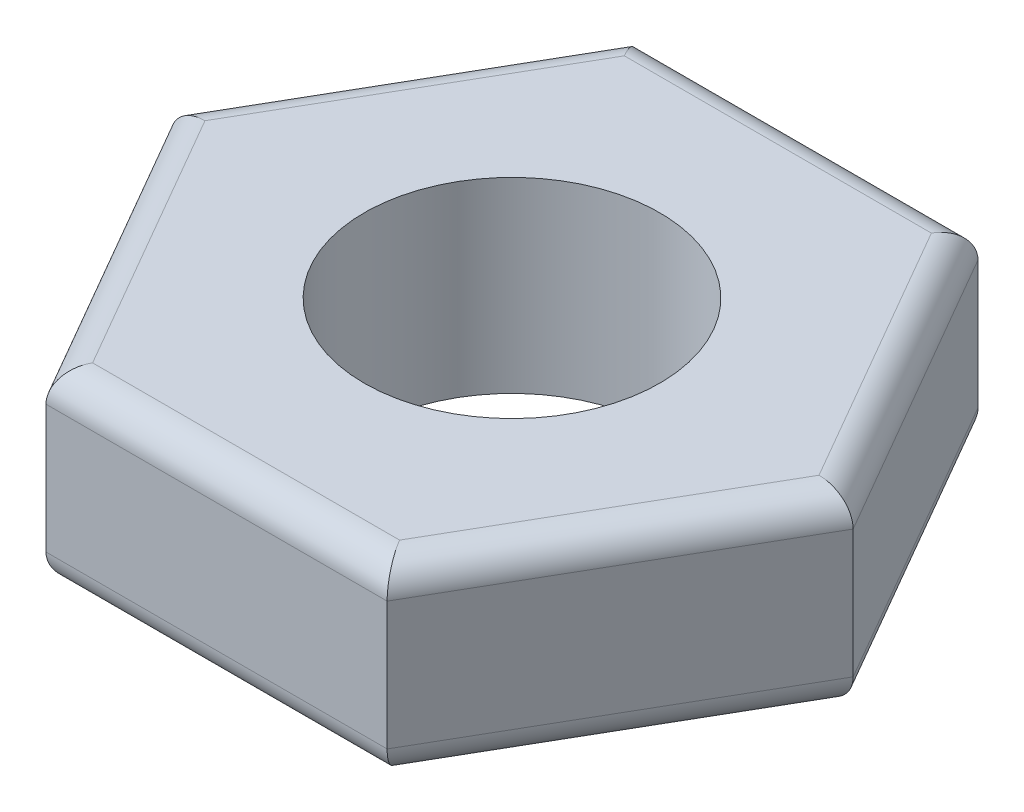
ISO-10303-21;
HEADER;
FILE_DESCRIPTION(('STEP AP214'),'2;1');
FILE_NAME('part.step','',(''),(''),'','','');
FILE_SCHEMA(('AUTOMOTIVE_DESIGN { 1 0 10303 214 1 1 1 1 }'));
ENDSEC;
DATA;
#1=APPLICATION_CONTEXT('core data for automotive mechanical design processes');
#2=APPLICATION_PROTOCOL_DEFINITION('international standard','automotive_design',2000,#1);
#3=PRODUCT_CONTEXT('',#1,'mechanical');
#4=PRODUCT('Part','Part','',(#3));
#5=PRODUCT_RELATED_PRODUCT_CATEGORY('part','',(#4));
#6=PRODUCT_DEFINITION_FORMATION('','',#4);
#7=PRODUCT_DEFINITION_CONTEXT('part definition',#1,'design');
#8=PRODUCT_DEFINITION('design','',#6,#7);
#9=PRODUCT_DEFINITION_SHAPE('','',#8);
#10=(LENGTH_UNIT() NAMED_UNIT(*) SI_UNIT(.MILLI.,.METRE.));
#11=(NAMED_UNIT(*) PLANE_ANGLE_UNIT() SI_UNIT($,.RADIAN.));
#12=(NAMED_UNIT(*) SI_UNIT($,.STERADIAN.) SOLID_ANGLE_UNIT());
#13=UNCERTAINTY_MEASURE_WITH_UNIT(LENGTH_MEASURE(1.E-05),#10,'distance_accuracy_value','');
#14=(GEOMETRIC_REPRESENTATION_CONTEXT(3) GLOBAL_UNCERTAINTY_ASSIGNED_CONTEXT((#13)) GLOBAL_UNIT_ASSIGNED_CONTEXT((#10,
#11,#12)) REPRESENTATION_CONTEXT('',''));
#15=CARTESIAN_POINT('',(0.,0.,0.));
#16=DIRECTION('',(0.,0.,1.));
#17=DIRECTION('',(1.,0.,0.));
#18=AXIS2_PLACEMENT_3D('',#15,#16,#17);
#19=CARTESIAN_POINT('',(-1.73205080756886,1.9,3.00000000000001));
#20=DIRECTION('',(0.,0.,-1.));
#21=DIRECTION('',(-1.,0.,0.));
#22=AXIS2_PLACEMENT_3D('',#19,#20,#21);
#23=PLANE('',#22);
#24=DIRECTION('',(0.,-1.,0.));
#25=VECTOR('',#24,1.);
#26=CARTESIAN_POINT('',(-1.73205080756886,1.9,3.00000000000001));
#27=LINE('',#26,#25);
#28=CARTESIAN_POINT('',(-1.73205080756886,1.6,3.00000000000001));
#29=VERTEX_POINT('',#28);
#30=CARTESIAN_POINT('',(-1.73205080756886,0.3,3.00000000000001));
#31=VERTEX_POINT('',#30);
#32=EDGE_CURVE('E227',#29,#31,#27,.T.);
#33=ORIENTED_EDGE('',*,*,#32,.T.);
#34=DIRECTION('',(1.,0.,0.));
#35=VECTOR('',#34,1.);
#36=CARTESIAN_POINT('',(-1.73205080756886,0.3,3.00000000000001));
#37=LINE('',#36,#35);
#38=CARTESIAN_POINT('',(1.73205080756889,0.3,2.99999999999999));
#39=VERTEX_POINT('',#38);
#40=EDGE_CURVE('E193',#31,#39,#37,.T.);
#41=ORIENTED_EDGE('',*,*,#40,.T.);
#42=DIRECTION('',(0.,-1.,0.));
#43=VECTOR('',#42,1.);
#44=CARTESIAN_POINT('',(1.73205080756889,1.9,2.99999999999999));
#45=LINE('',#44,#43);
#46=CARTESIAN_POINT('',(1.73205080756889,1.6,2.99999999999999));
#47=VERTEX_POINT('',#46);
#48=EDGE_CURVE('E145',#47,#39,#45,.T.);
#49=ORIENTED_EDGE('',*,*,#48,.F.);
#50=DIRECTION('',(1.,0.,0.));
#51=VECTOR('',#50,1.);
#52=CARTESIAN_POINT('',(-1.73205080756886,1.6,3.00000000000001));
#53=LINE('',#52,#51);
#54=EDGE_CURVE('E195',#47,#29,#53,.F.);
#55=ORIENTED_EDGE('',*,*,#54,.T.);
#56=EDGE_LOOP('',(#33,#41,#49,#55));
#57=FACE_BOUND('',#56,.T.);
#58=ADVANCED_FACE('F34',(#57),#23,.F.);
#59=CARTESIAN_POINT('',(1.73205080756889,1.9,2.99999999999999));
#60=DIRECTION('',(-0.866025403784441,0.,-0.499999999999995));
#61=DIRECTION('',(-0.499999999999995,0.,0.866025403784441));
#62=AXIS2_PLACEMENT_3D('',#59,#60,#61);
#63=PLANE('',#62);
#64=ORIENTED_EDGE('',*,*,#48,.T.);
#65=DIRECTION('',(0.499999999999995,0.,-0.866025403784441));
#66=VECTOR('',#65,1.);
#67=CARTESIAN_POINT('',(1.73205080756889,0.3,2.99999999999999));
#68=LINE('',#67,#66);
#69=CARTESIAN_POINT('',(3.46410161513776,0.3,0.));
#70=VERTEX_POINT('',#69);
#71=EDGE_CURVE('E144',#39,#70,#68,.T.);
#72=ORIENTED_EDGE('',*,*,#71,.T.);
#73=DIRECTION('',(0.,-1.,0.));
#74=VECTOR('',#73,1.);
#75=CARTESIAN_POINT('',(3.46410161513776,1.9,0.));
#76=LINE('',#75,#74);
#77=CARTESIAN_POINT('',(3.46410161513776,1.6,0.));
#78=VERTEX_POINT('',#77);
#79=EDGE_CURVE('E127',#78,#70,#76,.T.);
#80=ORIENTED_EDGE('',*,*,#79,.F.);
#81=DIRECTION('',(0.499999999999995,0.,-0.866025403784441));
#82=VECTOR('',#81,1.);
#83=CARTESIAN_POINT('',(1.73205080756889,1.6,2.99999999999999));
#84=LINE('',#83,#82);
#85=EDGE_CURVE('E141',#78,#47,#84,.F.);
#86=ORIENTED_EDGE('',*,*,#85,.T.);
#87=EDGE_LOOP('',(#64,#72,#80,#86));
#88=FACE_BOUND('',#87,.T.);
#89=ADVANCED_FACE('F140',(#88),#63,.F.);
#90=CARTESIAN_POINT('',(3.46410161513776,1.9,0.));
#91=DIRECTION('',(-0.866025403784436,0.,0.500000000000005));
#92=DIRECTION('',(0.500000000000005,0.,0.866025403784436));
#93=AXIS2_PLACEMENT_3D('',#90,#91,#92);
#94=PLANE('',#93);
#95=ORIENTED_EDGE('',*,*,#79,.T.);
#96=DIRECTION('',(-0.500000000000005,0.,-0.866025403784436));
#97=VECTOR('',#96,1.);
#98=CARTESIAN_POINT('',(3.46410161513776,0.3,0.));
#99=LINE('',#98,#97);
#100=CARTESIAN_POINT('',(1.73205080756886,0.3,-3.00000000000001));
#101=VERTEX_POINT('',#100);
#102=EDGE_CURVE('E133',#70,#101,#99,.T.);
#103=ORIENTED_EDGE('',*,*,#102,.T.);
#104=DIRECTION('',(0.,-1.,0.));
#105=VECTOR('',#104,1.);
#106=CARTESIAN_POINT('',(1.73205080756886,1.9,-3.00000000000001));
#107=LINE('',#106,#105);
#108=CARTESIAN_POINT('',(1.73205080756886,1.6,-3.00000000000001));
#109=VERTEX_POINT('',#108);
#110=EDGE_CURVE('E129',#109,#101,#107,.T.);
#111=ORIENTED_EDGE('',*,*,#110,.F.);
#112=DIRECTION('',(-0.500000000000005,0.,-0.866025403784436));
#113=VECTOR('',#112,1.);
#114=CARTESIAN_POINT('',(3.46410161513776,1.6,0.));
#115=LINE('',#114,#113);
#116=EDGE_CURVE('E124',#109,#78,#115,.F.);
#117=ORIENTED_EDGE('',*,*,#116,.T.);
#118=EDGE_LOOP('',(#95,#103,#111,#117));
#119=FACE_BOUND('',#118,.T.);
#120=ADVANCED_FACE('F126',(#119),#94,.F.);
#121=CARTESIAN_POINT('',(1.73205080756886,1.9,-3.00000000000001));
#122=DIRECTION('',(0.,0.,1.));
#123=DIRECTION('',(1.,0.,0.));
#124=AXIS2_PLACEMENT_3D('',#121,#122,#123);
#125=PLANE('',#124);
#126=ORIENTED_EDGE('',*,*,#110,.T.);
#127=DIRECTION('',(-1.,0.,0.));
#128=VECTOR('',#127,1.);
#129=CARTESIAN_POINT('',(1.73205080756886,0.3,-3.00000000000001));
#130=LINE('',#129,#128);
#131=CARTESIAN_POINT('',(-1.73205080756889,0.3,-2.99999999999999));
#132=VERTEX_POINT('',#131);
#133=EDGE_CURVE('E206',#101,#132,#130,.T.);
#134=ORIENTED_EDGE('',*,*,#133,.T.);
#135=DIRECTION('',(0.,-1.,0.));
#136=VECTOR('',#135,1.);
#137=CARTESIAN_POINT('',(-1.73205080756889,1.9,-2.99999999999999));
#138=LINE('',#137,#136);
#139=CARTESIAN_POINT('',(-1.73205080756889,1.6,-2.99999999999999));
#140=VERTEX_POINT('',#139);
#141=EDGE_CURVE('E230',#140,#132,#138,.T.);
#142=ORIENTED_EDGE('',*,*,#141,.F.);
#143=DIRECTION('',(-1.,0.,0.));
#144=VECTOR('',#143,1.);
#145=CARTESIAN_POINT('',(1.73205080756886,1.6,-3.00000000000001));
#146=LINE('',#145,#144);
#147=EDGE_CURVE('E208',#140,#109,#146,.F.);
#148=ORIENTED_EDGE('',*,*,#147,.T.);
#149=EDGE_LOOP('',(#126,#134,#142,#148));
#150=FACE_BOUND('',#149,.T.);
#151=ADVANCED_FACE('F364',(#150),#125,.F.);
#152=CARTESIAN_POINT('',(-1.73205080756889,1.9,-2.99999999999999));
#153=DIRECTION('',(0.866025403784441,0.,0.499999999999996));
#154=DIRECTION('',(0.499999999999996,0.,-0.866025403784441));
#155=AXIS2_PLACEMENT_3D('',#152,#153,#154);
#156=PLANE('',#155);
#157=ORIENTED_EDGE('',*,*,#141,.T.);
#158=DIRECTION('',(-0.499999999999996,0.,0.866025403784441));
#159=VECTOR('',#158,1.);
#160=CARTESIAN_POINT('',(-1.73205080756889,0.3,-2.99999999999999));
#161=LINE('',#160,#159);
#162=CARTESIAN_POINT('',(-3.46410161513776,0.3,0.));
#163=VERTEX_POINT('',#162);
#164=EDGE_CURVE('E201',#132,#163,#161,.T.);
#165=ORIENTED_EDGE('',*,*,#164,.T.);
#166=DIRECTION('',(0.,-1.,0.));
#167=VECTOR('',#166,1.);
#168=CARTESIAN_POINT('',(-3.46410161513776,1.9,0.));
#169=LINE('',#168,#167);
#170=CARTESIAN_POINT('',(-3.46410161513776,1.6,0.));
#171=VERTEX_POINT('',#170);
#172=EDGE_CURVE('E233',#171,#163,#169,.T.);
#173=ORIENTED_EDGE('',*,*,#172,.F.);
#174=DIRECTION('',(-0.499999999999996,0.,0.866025403784441));
#175=VECTOR('',#174,1.);
#176=CARTESIAN_POINT('',(-1.73205080756889,1.6,-2.99999999999999));
#177=LINE('',#176,#175);
#178=EDGE_CURVE('E203',#171,#140,#177,.F.);
#179=ORIENTED_EDGE('',*,*,#178,.T.);
#180=EDGE_LOOP('',(#157,#165,#173,#179));
#181=FACE_BOUND('',#180,.T.);
#182=ADVANCED_FACE('F255',(#181),#156,.F.);
#183=CARTESIAN_POINT('',(-3.46410161513776,1.9,0.));
#184=DIRECTION('',(0.866025403784436,0.,-0.500000000000004));
#185=DIRECTION('',(-0.500000000000004,0.,-0.866025403784436));
#186=AXIS2_PLACEMENT_3D('',#183,#184,#185);
#187=PLANE('',#186);
#188=ORIENTED_EDGE('',*,*,#172,.T.);
#189=DIRECTION('',(0.500000000000004,0.,0.866025403784436));
#190=VECTOR('',#189,1.);
#191=CARTESIAN_POINT('',(-3.46410161513776,0.3,0.));
#192=LINE('',#191,#190);
#193=EDGE_CURVE('E197',#163,#31,#192,.T.);
#194=ORIENTED_EDGE('',*,*,#193,.T.);
#195=ORIENTED_EDGE('',*,*,#32,.F.);
#196=DIRECTION('',(0.500000000000004,0.,0.866025403784436));
#197=VECTOR('',#196,1.);
#198=CARTESIAN_POINT('',(-3.46410161513776,1.6,0.));
#199=LINE('',#198,#197);
#200=EDGE_CURVE('E199',#29,#171,#199,.F.);
#201=ORIENTED_EDGE('',*,*,#200,.T.);
#202=EDGE_LOOP('',(#188,#194,#195,#201));
#203=FACE_BOUND('',#202,.T.);
#204=ADVANCED_FACE('F247',(#203),#187,.F.);
#205=CARTESIAN_POINT('',(0.,1.9,0.));
#206=DIRECTION('',(0.,1.,0.));
#207=DIRECTION('',(0.,0.,1.));
#208=AXIS2_PLACEMENT_3D('',#205,#206,#207);
#209=PLANE('',#208);
#210=DIRECTION('',(-1.,0.,0.));
#211=VECTOR('',#210,1.);
#212=CARTESIAN_POINT('',(-1.73205080756889,1.9,-2.69999999999999));
#213=LINE('',#212,#211);
#214=CARTESIAN_POINT('',(1.55884572681198,1.9,-2.70000000000001));
#215=VERTEX_POINT('',#214);
#216=CARTESIAN_POINT('',(-1.558845726812,1.9,-2.69999999999999));
#217=VERTEX_POINT('',#216);
#218=EDGE_CURVE('E43',#215,#217,#213,.T.);
#219=ORIENTED_EDGE('',*,*,#218,.T.);
#220=DIRECTION('',(-0.499999999999996,0.,0.866025403784441));
#221=VECTOR('',#220,1.);
#222=CARTESIAN_POINT('',(-3.20429399400242,1.9,0.150000000000017));
#223=LINE('',#222,#221);
#224=CARTESIAN_POINT('',(-3.11769145362398,1.9,0.));
#225=VERTEX_POINT('',#224);
#226=EDGE_CURVE('E11',#217,#225,#223,.T.);
#227=ORIENTED_EDGE('',*,*,#226,.T.);
#228=DIRECTION('',(0.500000000000004,0.,0.866025403784436));
#229=VECTOR('',#228,1.);
#230=CARTESIAN_POINT('',(-1.47224318643353,1.9,2.85000000000001));
#231=LINE('',#230,#229);
#232=CARTESIAN_POINT('',(-1.55884572681198,1.9,2.70000000000001));
#233=VERTEX_POINT('',#232);
#234=EDGE_CURVE('E191',#225,#233,#231,.T.);
#235=ORIENTED_EDGE('',*,*,#234,.T.);
#236=DIRECTION('',(1.,0.,0.));
#237=VECTOR('',#236,1.);
#238=CARTESIAN_POINT('',(1.73205080756889,1.9,2.69999999999999));
#239=LINE('',#238,#237);
#240=CARTESIAN_POINT('',(1.55884572681201,1.9,2.69999999999999));
#241=VERTEX_POINT('',#240);
#242=EDGE_CURVE('E189',#233,#241,#239,.T.);
#243=ORIENTED_EDGE('',*,*,#242,.T.);
#244=DIRECTION('',(0.499999999999995,0.,-0.866025403784441));
#245=VECTOR('',#244,1.);
#246=CARTESIAN_POINT('',(3.20429399400242,1.9,-0.150000000000017));
#247=LINE('',#246,#245);
#248=CARTESIAN_POINT('',(3.11769145362398,1.9,0.));
#249=VERTEX_POINT('',#248);
#250=EDGE_CURVE('E187',#241,#249,#247,.T.);
#251=ORIENTED_EDGE('',*,*,#250,.T.);
#252=DIRECTION('',(-0.500000000000005,0.,-0.866025403784436));
#253=VECTOR('',#252,1.);
#254=CARTESIAN_POINT('',(1.47224318643353,1.9,-2.85000000000001));
#255=LINE('',#254,#253);
#256=EDGE_CURVE('E54',#249,#215,#255,.T.);
#257=ORIENTED_EDGE('',*,*,#256,.T.);
#258=EDGE_LOOP('',(#219,#227,#235,#243,#251,#257));
#259=FACE_BOUND('',#258,.T.);
#260=CARTESIAN_POINT('',(0.,1.9,0.));
#261=DIRECTION('',(0.,1.,0.));
#262=DIRECTION('',(0.,0.,1.));
#263=AXIS2_PLACEMENT_3D('',#260,#261,#262);
#264=CIRCLE('',#263,1.5);
#265=CARTESIAN_POINT('',(0.,1.9,1.5));
#266=VERTEX_POINT('',#265);
#267=EDGE_CURVE('E174',#266,#266,#264,.T.);
#268=ORIENTED_EDGE('',*,*,#267,.F.);
#269=EDGE_LOOP('',(#268));
#270=FACE_BOUND('',#269,.T.);
#271=ADVANCED_FACE('F244',(#259,#270),#209,.T.);
#272=CARTESIAN_POINT('',(0.,0.,0.));
#273=DIRECTION('',(0.,1.,0.));
#274=DIRECTION('',(0.,0.,1.));
#275=AXIS2_PLACEMENT_3D('',#272,#273,#274);
#276=PLANE('',#275);
#277=DIRECTION('',(-0.500000000000005,0.,-0.866025403784436));
#278=VECTOR('',#277,1.);
#279=CARTESIAN_POINT('',(2.33826859021798,0.,-1.35000000000001));
#280=LINE('',#279,#278);
#281=CARTESIAN_POINT('',(1.55884572681198,0.,-2.70000000000001));
#282=VERTEX_POINT('',#281);
#283=CARTESIAN_POINT('',(3.11769145362398,0.,0.));
#284=VERTEX_POINT('',#283);
#285=EDGE_CURVE('E213',#282,#284,#280,.F.);
#286=ORIENTED_EDGE('',*,*,#285,.T.);
#287=DIRECTION('',(0.499999999999995,0.,-0.866025403784441));
#288=VECTOR('',#287,1.);
#289=CARTESIAN_POINT('',(2.33826859021799,0.,1.34999999999999));
#290=LINE('',#289,#288);
#291=CARTESIAN_POINT('',(1.55884572681201,0.,2.69999999999999));
#292=VERTEX_POINT('',#291);
#293=EDGE_CURVE('E134',#284,#292,#290,.F.);
#294=ORIENTED_EDGE('',*,*,#293,.T.);
#295=DIRECTION('',(1.,0.,0.));
#296=VECTOR('',#295,1.);
#297=CARTESIAN_POINT('',(0.,0.,2.7));
#298=LINE('',#297,#296);
#299=CARTESIAN_POINT('',(-1.55884572681198,0.,2.70000000000001));
#300=VERTEX_POINT('',#299);
#301=EDGE_CURVE('E221',#292,#300,#298,.F.);
#302=ORIENTED_EDGE('',*,*,#301,.T.);
#303=DIRECTION('',(0.500000000000004,0.,0.866025403784436));
#304=VECTOR('',#303,1.);
#305=CARTESIAN_POINT('',(-2.33826859021798,0.,1.35000000000001));
#306=LINE('',#305,#304);
#307=CARTESIAN_POINT('',(-3.11769145362398,0.,0.));
#308=VERTEX_POINT('',#307);
#309=EDGE_CURVE('E219',#300,#308,#306,.F.);
#310=ORIENTED_EDGE('',*,*,#309,.T.);
#311=DIRECTION('',(-0.499999999999996,0.,0.866025403784441));
#312=VECTOR('',#311,1.);
#313=CARTESIAN_POINT('',(-2.33826859021799,0.,-1.34999999999999));
#314=LINE('',#313,#312);
#315=CARTESIAN_POINT('',(-1.558845726812,0.,-2.69999999999999));
#316=VERTEX_POINT('',#315);
#317=EDGE_CURVE('E217',#308,#316,#314,.F.);
#318=ORIENTED_EDGE('',*,*,#317,.T.);
#319=DIRECTION('',(-1.,0.,0.));
#320=VECTOR('',#319,1.);
#321=CARTESIAN_POINT('',(0.,0.,-2.7));
#322=LINE('',#321,#320);
#323=EDGE_CURVE('E215',#316,#282,#322,.F.);
#324=ORIENTED_EDGE('',*,*,#323,.T.);
#325=EDGE_LOOP('',(#286,#294,#302,#310,#318,#324));
#326=FACE_BOUND('',#325,.T.);
#327=CARTESIAN_POINT('',(0.,0.,0.));
#328=DIRECTION('',(0.,1.,0.));
#329=DIRECTION('',(0.,0.,1.));
#330=AXIS2_PLACEMENT_3D('',#327,#328,#329);
#331=CIRCLE('',#330,1.5);
#332=CARTESIAN_POINT('',(0.,0.,1.5));
#333=VERTEX_POINT('',#332);
#334=EDGE_CURVE('E224',#333,#333,#331,.T.);
#335=ORIENTED_EDGE('',*,*,#334,.T.);
#336=EDGE_LOOP('',(#335));
#337=FACE_BOUND('',#336,.T.);
#338=ADVANCED_FACE('F246',(#326,#337),#276,.F.);
#339=CARTESIAN_POINT('',(0.,-0.4,0.));
#340=DIRECTION('',(0.,1.,0.));
#341=DIRECTION('',(0.,0.,1.));
#342=AXIS2_PLACEMENT_3D('',#339,#340,#341);
#343=CYLINDRICAL_SURFACE('',#342,1.5);
#344=ORIENTED_EDGE('',*,*,#267,.T.);
#345=EDGE_LOOP('',(#344));
#346=FACE_BOUND('',#345,.T.);
#347=ORIENTED_EDGE('',*,*,#334,.F.);
#348=EDGE_LOOP('',(#347));
#349=FACE_BOUND('',#348,.T.);
#350=ADVANCED_FACE('F241',(#346,#349),#343,.F.);
#351=CARTESIAN_POINT('',(-1.47224318643356,0.3,-2.84999999999999));
#352=DIRECTION('',(-0.499999999999996,0.,0.866025403784441));
#353=DIRECTION('',(0.866025403784441,0.,0.499999999999996));
#354=AXIS2_PLACEMENT_3D('',#351,#352,#353);
#355=CYLINDRICAL_SURFACE('',#354,0.3);
#356=CARTESIAN_POINT('',(-1.558845726812,0.3,-2.69999999999999));
#357=DIRECTION('',(-0.866025403784436,0.,0.500000000000004));
#358=DIRECTION('',(0.500000000000005,0.,0.866025403784436));
#359=AXIS2_PLACEMENT_3D('',#356,#357,#358);
#360=ELLIPSE('',#359,0.346410161513775,0.3);
#361=EDGE_CURVE('E175',#316,#132,#360,.F.);
#362=ORIENTED_EDGE('',*,*,#361,.F.);
#363=ORIENTED_EDGE('',*,*,#317,.F.);
#364=CARTESIAN_POINT('',(-3.11769145362398,0.3,0.));
#365=DIRECTION('',(0.,0.,1.));
#366=DIRECTION('',(1.,0.,0.));
#367=AXIS2_PLACEMENT_3D('',#364,#365,#366);
#368=ELLIPSE('',#367,0.346410161513775,0.3);
#369=EDGE_CURVE('E171',#163,#308,#368,.T.);
#370=ORIENTED_EDGE('',*,*,#369,.F.);
#371=ORIENTED_EDGE('',*,*,#164,.F.);
#372=EDGE_LOOP('',(#362,#363,#370,#371));
#373=FACE_BOUND('',#372,.T.);
#374=ADVANCED_FACE('F287',(#373),#355,.T.);
#375=CARTESIAN_POINT('',(-3.20429399400243,0.3,-0.149999999999983));
#376=DIRECTION('',(0.500000000000004,0.,0.866025403784436));
#377=DIRECTION('',(0.866025403784436,0.,-0.500000000000004));
#378=AXIS2_PLACEMENT_3D('',#375,#376,#377);
#379=CYLINDRICAL_SURFACE('',#378,0.3);
#380=ORIENTED_EDGE('',*,*,#369,.T.);
#381=ORIENTED_EDGE('',*,*,#309,.F.);
#382=CARTESIAN_POINT('',(-1.55884572681198,0.3,2.70000000000001));
#383=DIRECTION('',(0.866025403784441,0.,0.499999999999996));
#384=DIRECTION('',(0.499999999999996,0.,-0.866025403784441));
#385=AXIS2_PLACEMENT_3D('',#382,#383,#384);
#386=ELLIPSE('',#385,0.346410161513775,0.3);
#387=EDGE_CURVE('E178',#31,#300,#386,.T.);
#388=ORIENTED_EDGE('',*,*,#387,.F.);
#389=ORIENTED_EDGE('',*,*,#193,.F.);
#390=EDGE_LOOP('',(#380,#381,#388,#389));
#391=FACE_BOUND('',#390,.T.);
#392=ADVANCED_FACE('F283',(#391),#379,.T.);
#393=CARTESIAN_POINT('',(1.73205080756886,0.3,-2.70000000000001));
#394=DIRECTION('',(-1.,0.,0.));
#395=DIRECTION('',(0.,0.,1.));
#396=AXIS2_PLACEMENT_3D('',#393,#394,#395);
#397=CYLINDRICAL_SURFACE('',#396,0.3);
#398=ORIENTED_EDGE('',*,*,#361,.T.);
#399=ORIENTED_EDGE('',*,*,#133,.F.);
#400=CARTESIAN_POINT('',(1.55884572681198,0.3,-2.70000000000001));
#401=DIRECTION('',(-0.866025403784441,0.,-0.499999999999996));
#402=DIRECTION('',(-0.499999999999995,0.,0.866025403784441));
#403=AXIS2_PLACEMENT_3D('',#400,#401,#402);
#404=ELLIPSE('',#403,0.346410161513775,0.3);
#405=EDGE_CURVE('E181',#282,#101,#404,.F.);
#406=ORIENTED_EDGE('',*,*,#405,.F.);
#407=ORIENTED_EDGE('',*,*,#323,.F.);
#408=EDGE_LOOP('',(#398,#399,#406,#407));
#409=FACE_BOUND('',#408,.T.);
#410=ADVANCED_FACE('F279',(#409),#397,.T.);
#411=CARTESIAN_POINT('',(-1.73205080756886,0.3,2.70000000000001));
#412=DIRECTION('',(1.,0.,0.));
#413=DIRECTION('',(0.,0.,-1.));
#414=AXIS2_PLACEMENT_3D('',#411,#412,#413);
#415=CYLINDRICAL_SURFACE('',#414,0.3);
#416=ORIENTED_EDGE('',*,*,#387,.T.);
#417=ORIENTED_EDGE('',*,*,#301,.F.);
#418=CARTESIAN_POINT('',(1.55884572681201,0.3,2.69999999999999));
#419=DIRECTION('',(0.866025403784436,0.,-0.500000000000005));
#420=DIRECTION('',(0.500000000000004,0.,0.866025403784436));
#421=AXIS2_PLACEMENT_3D('',#418,#419,#420);
#422=ELLIPSE('',#421,0.346410161513775,0.3);
#423=EDGE_CURVE('E157',#39,#292,#422,.T.);
#424=ORIENTED_EDGE('',*,*,#423,.F.);
#425=ORIENTED_EDGE('',*,*,#40,.F.);
#426=EDGE_LOOP('',(#416,#417,#424,#425));
#427=FACE_BOUND('',#426,.T.);
#428=ADVANCED_FACE('F275',(#427),#415,.T.);
#429=CARTESIAN_POINT('',(3.20429399400243,0.3,0.149999999999983));
#430=DIRECTION('',(-0.500000000000005,0.,-0.866025403784436));
#431=DIRECTION('',(-0.866025403784436,0.,0.500000000000005));
#432=AXIS2_PLACEMENT_3D('',#429,#430,#431);
#433=CYLINDRICAL_SURFACE('',#432,0.3);
#434=ORIENTED_EDGE('',*,*,#405,.T.);
#435=ORIENTED_EDGE('',*,*,#102,.F.);
#436=CARTESIAN_POINT('',(3.11769145362398,0.3,0.));
#437=DIRECTION('',(0.,0.,-1.));
#438=DIRECTION('',(-1.,0.,0.));
#439=AXIS2_PLACEMENT_3D('',#436,#437,#438);
#440=ELLIPSE('',#439,0.346410161513775,0.3);
#441=EDGE_CURVE('E156',#284,#70,#440,.F.);
#442=ORIENTED_EDGE('',*,*,#441,.F.);
#443=ORIENTED_EDGE('',*,*,#285,.F.);
#444=EDGE_LOOP('',(#434,#435,#442,#443));
#445=FACE_BOUND('',#444,.T.);
#446=ADVANCED_FACE('F271',(#445),#433,.T.);
#447=CARTESIAN_POINT('',(1.47224318643356,0.3,2.84999999999999));
#448=DIRECTION('',(0.499999999999995,0.,-0.866025403784441));
#449=DIRECTION('',(-0.866025403784441,0.,-0.499999999999995));
#450=AXIS2_PLACEMENT_3D('',#447,#448,#449);
#451=CYLINDRICAL_SURFACE('',#450,0.3);
#452=ORIENTED_EDGE('',*,*,#423,.T.);
#453=ORIENTED_EDGE('',*,*,#293,.F.);
#454=ORIENTED_EDGE('',*,*,#441,.T.);
#455=ORIENTED_EDGE('',*,*,#71,.F.);
#456=EDGE_LOOP('',(#452,#453,#454,#455));
#457=FACE_BOUND('',#456,.T.);
#458=ADVANCED_FACE('F268',(#457),#451,.T.);
#459=CARTESIAN_POINT('',(2.33826859021799,1.6,1.34999999999999));
#460=DIRECTION('',(-0.499999999999995,0.,0.866025403784441));
#461=DIRECTION('',(0.866025403784441,0.,0.499999999999995));
#462=AXIS2_PLACEMENT_3D('',#459,#460,#461);
#463=CYLINDRICAL_SURFACE('',#462,0.3);
#464=CARTESIAN_POINT('',(1.558845726812,1.6,2.69999999999999));
#465=DIRECTION('',(-0.866025403784436,0.,0.500000000000005));
#466=DIRECTION('',(-0.500000000000004,0.,-0.866025403784436));
#467=AXIS2_PLACEMENT_3D('',#464,#465,#466);
#468=ELLIPSE('',#467,0.346410161513775,0.3);
#469=EDGE_CURVE('E152',#47,#241,#468,.T.);
#470=ORIENTED_EDGE('',*,*,#469,.F.);
#471=ORIENTED_EDGE('',*,*,#85,.F.);
#472=CARTESIAN_POINT('',(3.11769145362398,1.6,0.));
#473=DIRECTION('',(0.,0.,1.));
#474=DIRECTION('',(-1.,0.,0.));
#475=AXIS2_PLACEMENT_3D('',#472,#473,#474);
#476=ELLIPSE('',#475,0.346410161513775,0.3);
#477=EDGE_CURVE('E38',#249,#78,#476,.F.);
#478=ORIENTED_EDGE('',*,*,#477,.F.);
#479=ORIENTED_EDGE('',*,*,#250,.F.);
#480=EDGE_LOOP('',(#470,#471,#478,#479));
#481=FACE_BOUND('',#480,.T.);
#482=ADVANCED_FACE('F36',(#481),#463,.T.);
#483=CARTESIAN_POINT('',(2.33826859021798,1.6,-1.35000000000001));
#484=DIRECTION('',(0.500000000000005,0.,0.866025403784436));
#485=DIRECTION('',(0.866025403784436,0.,-0.500000000000005));
#486=AXIS2_PLACEMENT_3D('',#483,#484,#485);
#487=CYLINDRICAL_SURFACE('',#486,0.3);
#488=ORIENTED_EDGE('',*,*,#477,.T.);
#489=ORIENTED_EDGE('',*,*,#116,.F.);
#490=CARTESIAN_POINT('',(1.55884572681198,1.6,-2.70000000000001));
#491=DIRECTION('',(0.866025403784441,0.,0.499999999999996));
#492=DIRECTION('',(-0.499999999999995,0.,0.866025403784441));
#493=AXIS2_PLACEMENT_3D('',#490,#491,#492);
#494=ELLIPSE('',#493,0.346410161513775,0.3);
#495=EDGE_CURVE('E159',#215,#109,#494,.F.);
#496=ORIENTED_EDGE('',*,*,#495,.F.);
#497=ORIENTED_EDGE('',*,*,#256,.F.);
#498=EDGE_LOOP('',(#488,#489,#496,#497));
#499=FACE_BOUND('',#498,.T.);
#500=ADVANCED_FACE('F155',(#499),#487,.T.);
#501=CARTESIAN_POINT('',(0.,1.6,2.7));
#502=DIRECTION('',(-1.,0.,0.));
#503=DIRECTION('',(0.,0.,1.));
#504=AXIS2_PLACEMENT_3D('',#501,#502,#503);
#505=CYLINDRICAL_SURFACE('',#504,0.3);
#506=ORIENTED_EDGE('',*,*,#469,.T.);
#507=ORIENTED_EDGE('',*,*,#242,.F.);
#508=CARTESIAN_POINT('',(-1.55884572681198,1.6,2.70000000000001));
#509=DIRECTION('',(-0.866025403784441,0.,-0.499999999999996));
#510=DIRECTION('',(0.499999999999996,0.,-0.866025403784441));
#511=AXIS2_PLACEMENT_3D('',#508,#509,#510);
#512=ELLIPSE('',#511,0.346410161513775,0.3);
#513=EDGE_CURVE('E162',#29,#233,#512,.T.);
#514=ORIENTED_EDGE('',*,*,#513,.F.);
#515=ORIENTED_EDGE('',*,*,#54,.F.);
#516=EDGE_LOOP('',(#506,#507,#514,#515));
#517=FACE_BOUND('',#516,.T.);
#518=ADVANCED_FACE('F303',(#517),#505,.T.);
#519=CARTESIAN_POINT('',(0.,1.6,-2.7));
#520=DIRECTION('',(1.,0.,0.));
#521=DIRECTION('',(0.,0.,-1.));
#522=AXIS2_PLACEMENT_3D('',#519,#520,#521);
#523=CYLINDRICAL_SURFACE('',#522,0.3);
#524=ORIENTED_EDGE('',*,*,#495,.T.);
#525=ORIENTED_EDGE('',*,*,#147,.F.);
#526=CARTESIAN_POINT('',(-1.558845726812,1.6,-2.69999999999999));
#527=DIRECTION('',(0.866025403784436,0.,-0.500000000000004));
#528=DIRECTION('',(0.500000000000005,0.,0.866025403784436));
#529=AXIS2_PLACEMENT_3D('',#526,#527,#528);
#530=ELLIPSE('',#529,0.346410161513775,0.3);
#531=EDGE_CURVE('E167',#217,#140,#530,.F.);
#532=ORIENTED_EDGE('',*,*,#531,.F.);
#533=ORIENTED_EDGE('',*,*,#218,.F.);
#534=EDGE_LOOP('',(#524,#525,#532,#533));
#535=FACE_BOUND('',#534,.T.);
#536=ADVANCED_FACE('F299',(#535),#523,.T.);
#537=CARTESIAN_POINT('',(-2.33826859021798,1.6,1.35000000000001));
#538=DIRECTION('',(-0.500000000000004,0.,-0.866025403784436));
#539=DIRECTION('',(-0.866025403784436,0.,0.500000000000004));
#540=AXIS2_PLACEMENT_3D('',#537,#538,#539);
#541=CYLINDRICAL_SURFACE('',#540,0.3);
#542=ORIENTED_EDGE('',*,*,#513,.T.);
#543=ORIENTED_EDGE('',*,*,#234,.F.);
#544=CARTESIAN_POINT('',(-3.11769145362398,1.6,0.));
#545=DIRECTION('',(0.,0.,-1.));
#546=DIRECTION('',(-1.,0.,0.));
#547=AXIS2_PLACEMENT_3D('',#544,#545,#546);
#548=ELLIPSE('',#547,0.346410161513775,0.3);
#549=EDGE_CURVE('E169',#171,#225,#548,.T.);
#550=ORIENTED_EDGE('',*,*,#549,.F.);
#551=ORIENTED_EDGE('',*,*,#200,.F.);
#552=EDGE_LOOP('',(#542,#543,#550,#551));
#553=FACE_BOUND('',#552,.T.);
#554=ADVANCED_FACE('F295',(#553),#541,.T.);
#555=CARTESIAN_POINT('',(-2.33826859021799,1.6,-1.34999999999999));
#556=DIRECTION('',(0.499999999999996,0.,-0.866025403784441));
#557=DIRECTION('',(-0.866025403784441,0.,-0.499999999999996));
#558=AXIS2_PLACEMENT_3D('',#555,#556,#557);
#559=CYLINDRICAL_SURFACE('',#558,0.3);
#560=ORIENTED_EDGE('',*,*,#531,.T.);
#561=ORIENTED_EDGE('',*,*,#178,.F.);
#562=ORIENTED_EDGE('',*,*,#549,.T.);
#563=ORIENTED_EDGE('',*,*,#226,.F.);
#564=EDGE_LOOP('',(#560,#561,#562,#563));
#565=FACE_BOUND('',#564,.T.);
#566=ADVANCED_FACE('F292',(#565),#559,.T.);
#567=CLOSED_SHELL('',(#58,#89,#120,#151,#182,#204,#271,#338,#350,#374,#392,#410,#428,#446,#458,
#482,#500,#518,#536,#554,#566));
#568=MANIFOLD_SOLID_BREP('B2',#567);
#569=ADVANCED_BREP_SHAPE_REPRESENTATION('',(#18,#568),#14);
#570=SHAPE_DEFINITION_REPRESENTATION(#9,#569);
ENDSEC;
END-ISO-10303-21;
